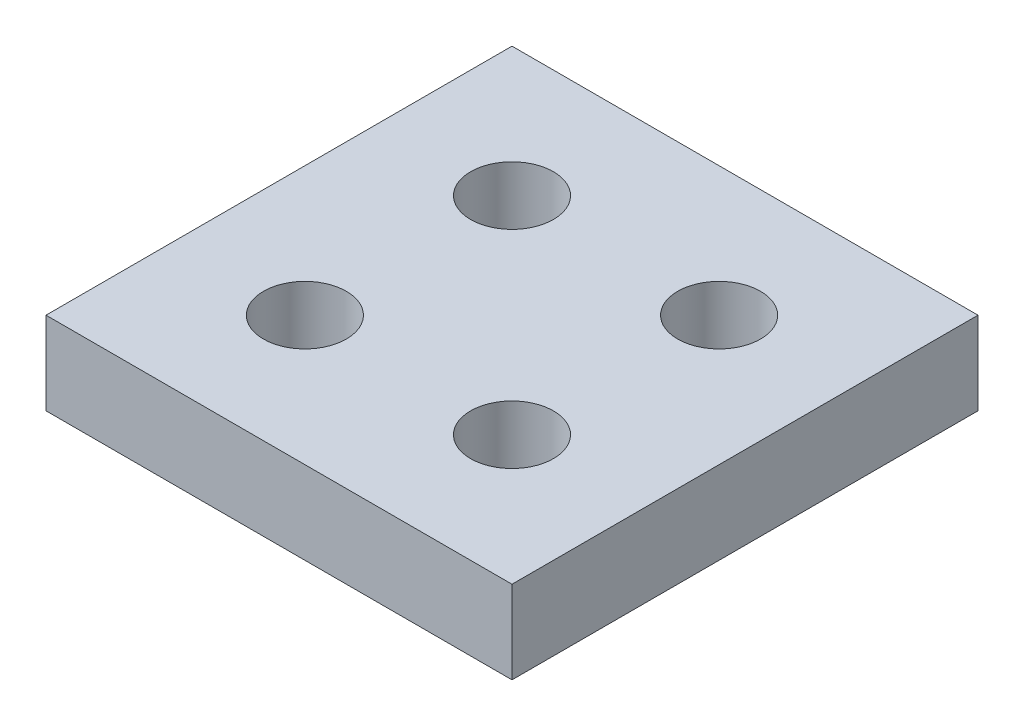
ISO-10303-21;
HEADER;
FILE_DESCRIPTION(('STEP AP214'),'2;1');
FILE_NAME('part.step','',(''),(''),'','','');
FILE_SCHEMA(('AUTOMOTIVE_DESIGN { 1 0 10303 214 1 1 1 1 }'));
ENDSEC;
DATA;
#1=APPLICATION_CONTEXT('core data for automotive mechanical design processes');
#2=APPLICATION_PROTOCOL_DEFINITION('international standard','automotive_design',2000,#1);
#3=PRODUCT_CONTEXT('',#1,'mechanical');
#4=PRODUCT('Part','Part','',(#3));
#5=PRODUCT_RELATED_PRODUCT_CATEGORY('part','',(#4));
#6=PRODUCT_DEFINITION_FORMATION('','',#4);
#7=PRODUCT_DEFINITION_CONTEXT('part definition',#1,'design');
#8=PRODUCT_DEFINITION('design','',#6,#7);
#9=PRODUCT_DEFINITION_SHAPE('','',#8);
#10=(LENGTH_UNIT() NAMED_UNIT(*) SI_UNIT(.MILLI.,.METRE.));
#11=(NAMED_UNIT(*) PLANE_ANGLE_UNIT() SI_UNIT($,.RADIAN.));
#12=(NAMED_UNIT(*) SI_UNIT($,.STERADIAN.) SOLID_ANGLE_UNIT());
#13=UNCERTAINTY_MEASURE_WITH_UNIT(LENGTH_MEASURE(1.E-05),#10,'distance_accuracy_value','');
#14=(GEOMETRIC_REPRESENTATION_CONTEXT(3) GLOBAL_UNCERTAINTY_ASSIGNED_CONTEXT((#13)) GLOBAL_UNIT_ASSIGNED_CONTEXT((#10,
#11,#12)) REPRESENTATION_CONTEXT('',''));
#15=CARTESIAN_POINT('',(0.,0.,0.));
#16=DIRECTION('',(0.,0.,1.));
#17=DIRECTION('',(1.,0.,0.));
#18=AXIS2_PLACEMENT_3D('',#15,#16,#17);
#19=CARTESIAN_POINT('',(0.,0.8,0.));
#20=DIRECTION('',(0.,-1.,0.));
#21=DIRECTION('',(0.,0.,-1.));
#22=AXIS2_PLACEMENT_3D('',#19,#20,#21);
#23=PLANE('',#22);
#24=DIRECTION('',(0.,0.,-1.));
#25=VECTOR('',#24,1.);
#26=CARTESIAN_POINT('',(2.25,0.8,2.24999999999999));
#27=LINE('',#26,#25);
#28=CARTESIAN_POINT('',(2.25,0.8,2.24999999999999));
#29=VERTEX_POINT('',#28);
#30=CARTESIAN_POINT('',(2.25,0.8,-2.24999999999999));
#31=VERTEX_POINT('',#30);
#32=EDGE_CURVE('E87',#29,#31,#27,.T.);
#33=ORIENTED_EDGE('',*,*,#32,.T.);
#34=DIRECTION('',(-1.,0.,0.));
#35=VECTOR('',#34,1.);
#36=CARTESIAN_POINT('',(-2.25,0.8,-2.24999999999999));
#37=LINE('',#36,#35);
#38=CARTESIAN_POINT('',(-2.25,0.8,-2.24999999999999));
#39=VERTEX_POINT('',#38);
#40=EDGE_CURVE('E82',#31,#39,#37,.T.);
#41=ORIENTED_EDGE('',*,*,#40,.T.);
#42=DIRECTION('',(0.,0.,1.));
#43=VECTOR('',#42,1.);
#44=CARTESIAN_POINT('',(-2.25,0.8,2.24999999999999));
#45=LINE('',#44,#43);
#46=CARTESIAN_POINT('',(-2.25,0.8,2.24999999999999));
#47=VERTEX_POINT('',#46);
#48=EDGE_CURVE('E85',#39,#47,#45,.T.);
#49=ORIENTED_EDGE('',*,*,#48,.T.);
#50=DIRECTION('',(1.,0.,0.));
#51=VECTOR('',#50,1.);
#52=CARTESIAN_POINT('',(-2.25,0.8,2.24999999999999));
#53=LINE('',#52,#51);
#54=EDGE_CURVE('E52',#47,#29,#53,.T.);
#55=ORIENTED_EDGE('',*,*,#54,.T.);
#56=EDGE_LOOP('',(#33,#41,#49,#55));
#57=FACE_BOUND('',#56,.T.);
#58=CARTESIAN_POINT('',(-1.00000000000001,0.8,-1.));
#59=DIRECTION('',(0.,1.,0.));
#60=DIRECTION('',(0.,0.,1.));
#61=AXIS2_PLACEMENT_3D('',#58,#59,#60);
#62=CIRCLE('',#61,0.399999999999999);
#63=CARTESIAN_POINT('',(-1.00000000000001,0.8,-0.600000000000001));
#64=VERTEX_POINT('',#63);
#65=EDGE_CURVE('E102',#64,#64,#62,.T.);
#66=ORIENTED_EDGE('',*,*,#65,.F.);
#67=EDGE_LOOP('',(#66));
#68=FACE_BOUND('',#67,.T.);
#69=CARTESIAN_POINT('',(1.,0.8,-1.00000000000007));
#70=DIRECTION('',(0.,1.,0.));
#71=DIRECTION('',(0.,0.,1.));
#72=AXIS2_PLACEMENT_3D('',#69,#70,#71);
#73=CIRCLE('',#72,0.4);
#74=CARTESIAN_POINT('',(1.,0.8,-0.600000000000071));
#75=VERTEX_POINT('',#74);
#76=EDGE_CURVE('E117',#75,#75,#73,.T.);
#77=ORIENTED_EDGE('',*,*,#76,.F.);
#78=EDGE_LOOP('',(#77));
#79=FACE_BOUND('',#78,.T.);
#80=CARTESIAN_POINT('',(1.00000000000007,0.8,0.999999999999934));
#81=DIRECTION('',(0.,1.,0.));
#82=DIRECTION('',(0.,0.,1.));
#83=AXIS2_PLACEMENT_3D('',#80,#81,#82);
#84=CIRCLE('',#83,0.4);
#85=CARTESIAN_POINT('',(1.00000000000007,0.8,1.39999999999993));
#86=VERTEX_POINT('',#85);
#87=EDGE_CURVE('E123',#86,#86,#84,.T.);
#88=ORIENTED_EDGE('',*,*,#87,.F.);
#89=EDGE_LOOP('',(#88));
#90=FACE_BOUND('',#89,.T.);
#91=CARTESIAN_POINT('',(-0.999999999999934,0.8,1.00000000000001));
#92=DIRECTION('',(0.,1.,0.));
#93=DIRECTION('',(0.,0.,1.));
#94=AXIS2_PLACEMENT_3D('',#91,#92,#93);
#95=CIRCLE('',#94,0.4);
#96=CARTESIAN_POINT('',(-0.999999999999934,0.8,1.40000000000001));
#97=VERTEX_POINT('',#96);
#98=EDGE_CURVE('E129',#97,#97,#95,.T.);
#99=ORIENTED_EDGE('',*,*,#98,.F.);
#100=EDGE_LOOP('',(#99));
#101=FACE_BOUND('',#100,.T.);
#102=ADVANCED_FACE('F35',(#57,#68,#79,#90,#101),#23,.F.);
#103=CARTESIAN_POINT('',(0.,0.,0.));
#104=DIRECTION('',(0.,-1.,0.));
#105=DIRECTION('',(0.,0.,-1.));
#106=AXIS2_PLACEMENT_3D('',#103,#104,#105);
#107=PLANE('',#106);
#108=CARTESIAN_POINT('',(1.00000000000007,0.,0.999999999999934));
#109=DIRECTION('',(0.,1.,0.));
#110=DIRECTION('',(0.,0.,1.));
#111=AXIS2_PLACEMENT_3D('',#108,#109,#110);
#112=CIRCLE('',#111,0.4);
#113=CARTESIAN_POINT('',(1.00000000000007,0.,1.39999999999993));
#114=VERTEX_POINT('',#113);
#115=EDGE_CURVE('E126',#114,#114,#112,.T.);
#116=ORIENTED_EDGE('',*,*,#115,.T.);
#117=EDGE_LOOP('',(#116));
#118=FACE_BOUND('',#117,.T.);
#119=CARTESIAN_POINT('',(-1.00000000000001,0.,-1.));
#120=DIRECTION('',(0.,1.,0.));
#121=DIRECTION('',(0.,0.,1.));
#122=AXIS2_PLACEMENT_3D('',#119,#120,#121);
#123=CIRCLE('',#122,0.399999999999999);
#124=CARTESIAN_POINT('',(-1.00000000000001,0.,-0.600000000000001));
#125=VERTEX_POINT('',#124);
#126=EDGE_CURVE('E114',#125,#125,#123,.T.);
#127=ORIENTED_EDGE('',*,*,#126,.T.);
#128=EDGE_LOOP('',(#127));
#129=FACE_BOUND('',#128,.T.);
#130=DIRECTION('',(0.,0.,-1.));
#131=VECTOR('',#130,1.);
#132=CARTESIAN_POINT('',(2.25,0.,2.24999999999999));
#133=LINE('',#132,#131);
#134=CARTESIAN_POINT('',(2.25,0.,2.24999999999999));
#135=VERTEX_POINT('',#134);
#136=CARTESIAN_POINT('',(2.25,0.,-2.24999999999999));
#137=VERTEX_POINT('',#136);
#138=EDGE_CURVE('E99',#135,#137,#133,.T.);
#139=ORIENTED_EDGE('',*,*,#138,.F.);
#140=DIRECTION('',(1.,0.,0.));
#141=VECTOR('',#140,1.);
#142=CARTESIAN_POINT('',(-2.25,0.,2.24999999999999));
#143=LINE('',#142,#141);
#144=CARTESIAN_POINT('',(-2.25,0.,2.24999999999999));
#145=VERTEX_POINT('',#144);
#146=EDGE_CURVE('E75',#145,#135,#143,.T.);
#147=ORIENTED_EDGE('',*,*,#146,.F.);
#148=DIRECTION('',(0.,0.,1.));
#149=VECTOR('',#148,1.);
#150=CARTESIAN_POINT('',(-2.25,0.,2.24999999999999));
#151=LINE('',#150,#149);
#152=CARTESIAN_POINT('',(-2.25,0.,-2.24999999999999));
#153=VERTEX_POINT('',#152);
#154=EDGE_CURVE('E69',#153,#145,#151,.T.);
#155=ORIENTED_EDGE('',*,*,#154,.F.);
#156=DIRECTION('',(-1.,0.,0.));
#157=VECTOR('',#156,1.);
#158=CARTESIAN_POINT('',(-2.25,0.,-2.24999999999999));
#159=LINE('',#158,#157);
#160=EDGE_CURVE('E91',#137,#153,#159,.T.);
#161=ORIENTED_EDGE('',*,*,#160,.F.);
#162=EDGE_LOOP('',(#139,#147,#155,#161));
#163=FACE_BOUND('',#162,.T.);
#164=CARTESIAN_POINT('',(1.,0.,-1.00000000000007));
#165=DIRECTION('',(0.,1.,0.));
#166=DIRECTION('',(0.,0.,1.));
#167=AXIS2_PLACEMENT_3D('',#164,#165,#166);
#168=CIRCLE('',#167,0.4);
#169=CARTESIAN_POINT('',(1.,0.,-0.600000000000071));
#170=VERTEX_POINT('',#169);
#171=EDGE_CURVE('E120',#170,#170,#168,.T.);
#172=ORIENTED_EDGE('',*,*,#171,.T.);
#173=EDGE_LOOP('',(#172));
#174=FACE_BOUND('',#173,.T.);
#175=CARTESIAN_POINT('',(-0.999999999999934,0.,1.00000000000001));
#176=DIRECTION('',(0.,1.,0.));
#177=DIRECTION('',(0.,0.,1.));
#178=AXIS2_PLACEMENT_3D('',#175,#176,#177);
#179=CIRCLE('',#178,0.4);
#180=CARTESIAN_POINT('',(-0.999999999999934,0.,1.40000000000001));
#181=VERTEX_POINT('',#180);
#182=EDGE_CURVE('E132',#181,#181,#179,.T.);
#183=ORIENTED_EDGE('',*,*,#182,.T.);
#184=EDGE_LOOP('',(#183));
#185=FACE_BOUND('',#184,.T.);
#186=ADVANCED_FACE('F110',(#118,#129,#163,#174,#185),#107,.T.);
#187=CARTESIAN_POINT('',(2.25,0.8,2.24999999999999));
#188=DIRECTION('',(-1.,0.,0.));
#189=DIRECTION('',(0.,0.,1.));
#190=AXIS2_PLACEMENT_3D('',#187,#188,#189);
#191=PLANE('',#190);
#192=ORIENTED_EDGE('',*,*,#138,.T.);
#193=DIRECTION('',(0.,-1.,0.));
#194=VECTOR('',#193,1.);
#195=CARTESIAN_POINT('',(2.25,0.8,-2.24999999999999));
#196=LINE('',#195,#194);
#197=EDGE_CURVE('E11',#31,#137,#196,.T.);
#198=ORIENTED_EDGE('',*,*,#197,.F.);
#199=ORIENTED_EDGE('',*,*,#32,.F.);
#200=DIRECTION('',(0.,-1.,0.));
#201=VECTOR('',#200,1.);
#202=CARTESIAN_POINT('',(2.25,0.8,2.24999999999999));
#203=LINE('',#202,#201);
#204=EDGE_CURVE('E95',#29,#135,#203,.T.);
#205=ORIENTED_EDGE('',*,*,#204,.T.);
#206=EDGE_LOOP('',(#192,#198,#199,#205));
#207=FACE_BOUND('',#206,.T.);
#208=ADVANCED_FACE('F37',(#207),#191,.F.);
#209=CARTESIAN_POINT('',(-2.25,0.8,-2.24999999999999));
#210=DIRECTION('',(0.,0.,1.));
#211=DIRECTION('',(1.,0.,0.));
#212=AXIS2_PLACEMENT_3D('',#209,#210,#211);
#213=PLANE('',#212);
#214=ORIENTED_EDGE('',*,*,#160,.T.);
#215=DIRECTION('',(0.,-1.,0.));
#216=VECTOR('',#215,1.);
#217=CARTESIAN_POINT('',(-2.25,0.8,-2.24999999999999));
#218=LINE('',#217,#216);
#219=EDGE_CURVE('E44',#39,#153,#218,.T.);
#220=ORIENTED_EDGE('',*,*,#219,.F.);
#221=ORIENTED_EDGE('',*,*,#40,.F.);
#222=ORIENTED_EDGE('',*,*,#197,.T.);
#223=EDGE_LOOP('',(#214,#220,#221,#222));
#224=FACE_BOUND('',#223,.T.);
#225=ADVANCED_FACE('F90',(#224),#213,.F.);
#226=CARTESIAN_POINT('',(-2.25,0.8,2.24999999999999));
#227=DIRECTION('',(1.,0.,0.));
#228=DIRECTION('',(0.,0.,-1.));
#229=AXIS2_PLACEMENT_3D('',#226,#227,#228);
#230=PLANE('',#229);
#231=ORIENTED_EDGE('',*,*,#154,.T.);
#232=DIRECTION('',(0.,-1.,0.));
#233=VECTOR('',#232,1.);
#234=CARTESIAN_POINT('',(-2.25,0.8,2.24999999999999));
#235=LINE('',#234,#233);
#236=EDGE_CURVE('E92',#47,#145,#235,.T.);
#237=ORIENTED_EDGE('',*,*,#236,.F.);
#238=ORIENTED_EDGE('',*,*,#48,.F.);
#239=ORIENTED_EDGE('',*,*,#219,.T.);
#240=EDGE_LOOP('',(#231,#237,#238,#239));
#241=FACE_BOUND('',#240,.T.);
#242=ADVANCED_FACE('F93',(#241),#230,.F.);
#243=CARTESIAN_POINT('',(-2.25,0.8,2.24999999999999));
#244=DIRECTION('',(0.,0.,-1.));
#245=DIRECTION('',(-1.,0.,0.));
#246=AXIS2_PLACEMENT_3D('',#243,#244,#245);
#247=PLANE('',#246);
#248=ORIENTED_EDGE('',*,*,#146,.T.);
#249=ORIENTED_EDGE('',*,*,#204,.F.);
#250=ORIENTED_EDGE('',*,*,#54,.F.);
#251=ORIENTED_EDGE('',*,*,#236,.T.);
#252=EDGE_LOOP('',(#248,#249,#250,#251));
#253=FACE_BOUND('',#252,.T.);
#254=ADVANCED_FACE('F107',(#253),#247,.F.);
#255=CARTESIAN_POINT('',(-1.00000000000001,0.8,-1.));
#256=DIRECTION('',(0.,-1.,0.));
#257=DIRECTION('',(0.,0.,-1.));
#258=AXIS2_PLACEMENT_3D('',#255,#256,#257);
#259=CYLINDRICAL_SURFACE('',#258,0.399999999999999);
#260=ORIENTED_EDGE('',*,*,#65,.T.);
#261=EDGE_LOOP('',(#260));
#262=FACE_BOUND('',#261,.T.);
#263=ORIENTED_EDGE('',*,*,#126,.F.);
#264=EDGE_LOOP('',(#263));
#265=FACE_BOUND('',#264,.T.);
#266=ADVANCED_FACE('F149',(#262,#265),#259,.F.);
#267=CARTESIAN_POINT('',(1.,0.8,-1.00000000000007));
#268=DIRECTION('',(0.,-1.,0.));
#269=DIRECTION('',(0.,0.,-1.));
#270=AXIS2_PLACEMENT_3D('',#267,#268,#269);
#271=CYLINDRICAL_SURFACE('',#270,0.4);
#272=ORIENTED_EDGE('',*,*,#76,.T.);
#273=EDGE_LOOP('',(#272));
#274=FACE_BOUND('',#273,.T.);
#275=ORIENTED_EDGE('',*,*,#171,.F.);
#276=EDGE_LOOP('',(#275));
#277=FACE_BOUND('',#276,.T.);
#278=ADVANCED_FACE('F195',(#274,#277),#271,.F.);
#279=CARTESIAN_POINT('',(1.00000000000007,0.8,0.999999999999934));
#280=DIRECTION('',(0.,-1.,0.));
#281=DIRECTION('',(0.,0.,-1.));
#282=AXIS2_PLACEMENT_3D('',#279,#280,#281);
#283=CYLINDRICAL_SURFACE('',#282,0.4);
#284=ORIENTED_EDGE('',*,*,#87,.T.);
#285=EDGE_LOOP('',(#284));
#286=FACE_BOUND('',#285,.T.);
#287=ORIENTED_EDGE('',*,*,#115,.F.);
#288=EDGE_LOOP('',(#287));
#289=FACE_BOUND('',#288,.T.);
#290=ADVANCED_FACE('F203',(#286,#289),#283,.F.);
#291=CARTESIAN_POINT('',(-0.999999999999934,0.8,1.00000000000001));
#292=DIRECTION('',(0.,-1.,0.));
#293=DIRECTION('',(0.,0.,-1.));
#294=AXIS2_PLACEMENT_3D('',#291,#292,#293);
#295=CYLINDRICAL_SURFACE('',#294,0.4);
#296=ORIENTED_EDGE('',*,*,#98,.T.);
#297=EDGE_LOOP('',(#296));
#298=FACE_BOUND('',#297,.T.);
#299=ORIENTED_EDGE('',*,*,#182,.F.);
#300=EDGE_LOOP('',(#299));
#301=FACE_BOUND('',#300,.T.);
#302=ADVANCED_FACE('F138',(#298,#301),#295,.F.);
#303=CLOSED_SHELL('',(#102,#186,#208,#225,#242,#254,#266,#278,#290,#302));
#304=MANIFOLD_SOLID_BREP('B2',#303);
#305=ADVANCED_BREP_SHAPE_REPRESENTATION('',(#18,#304),#14);
#306=SHAPE_DEFINITION_REPRESENTATION(#9,#305);
ENDSEC;
END-ISO-10303-21;
